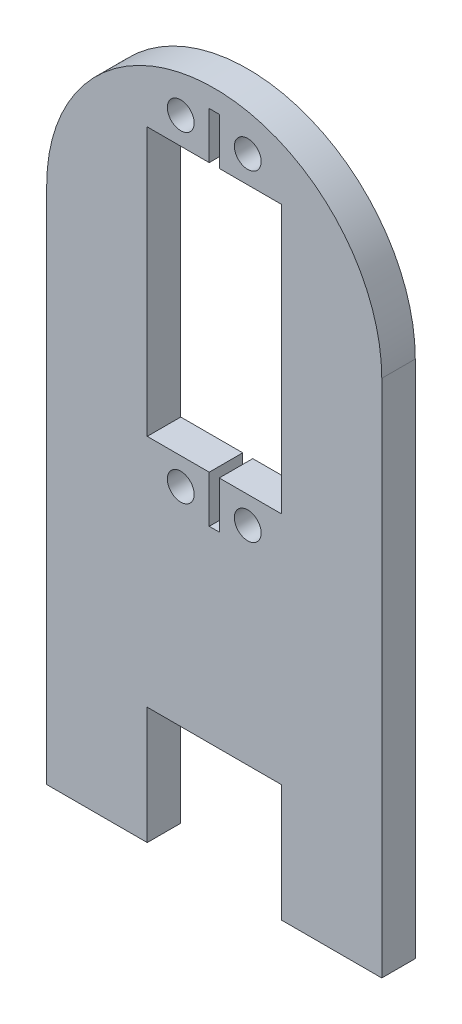
ISO-10303-21;
HEADER;
FILE_DESCRIPTION(('STEP AP214'),'2;1');
FILE_NAME('part.step','',(''),(''),'','','');
FILE_SCHEMA(('AUTOMOTIVE_DESIGN { 1 0 10303 214 1 1 1 1 }'));
ENDSEC;
DATA;
#1=APPLICATION_CONTEXT('core data for automotive mechanical design processes');
#2=APPLICATION_PROTOCOL_DEFINITION('international standard','automotive_design',2000,#1);
#3=PRODUCT_CONTEXT('',#1,'mechanical');
#4=PRODUCT('Part','Part','',(#3));
#5=PRODUCT_RELATED_PRODUCT_CATEGORY('part','',(#4));
#6=PRODUCT_DEFINITION_FORMATION('','',#4);
#7=PRODUCT_DEFINITION_CONTEXT('part definition',#1,'design');
#8=PRODUCT_DEFINITION('design','',#6,#7);
#9=PRODUCT_DEFINITION_SHAPE('','',#8);
#10=(LENGTH_UNIT() NAMED_UNIT(*) SI_UNIT(.MILLI.,.METRE.));
#11=(NAMED_UNIT(*) PLANE_ANGLE_UNIT() SI_UNIT($,.RADIAN.));
#12=(NAMED_UNIT(*) SI_UNIT($,.STERADIAN.) SOLID_ANGLE_UNIT());
#13=UNCERTAINTY_MEASURE_WITH_UNIT(LENGTH_MEASURE(1.E-05),#10,'distance_accuracy_value','');
#14=(GEOMETRIC_REPRESENTATION_CONTEXT(3) GLOBAL_UNCERTAINTY_ASSIGNED_CONTEXT((#13)) GLOBAL_UNIT_ASSIGNED_CONTEXT((#10,
#11,#12)) REPRESENTATION_CONTEXT('',''));
#15=CARTESIAN_POINT('',(0.,0.,0.));
#16=DIRECTION('',(0.,0.,1.));
#17=DIRECTION('',(1.,0.,0.));
#18=AXIS2_PLACEMENT_3D('',#15,#16,#17);
#19=CARTESIAN_POINT('',(4.99999999999999,24.,5.));
#20=DIRECTION('',(0.,0.,-1.));
#21=DIRECTION('',(-1.,0.,0.));
#22=AXIS2_PLACEMENT_3D('',#19,#20,#21);
#23=CYLINDRICAL_SURFACE('',#22,2.);
#24=CARTESIAN_POINT('',(4.99999999999999,24.,5.));
#25=DIRECTION('',(0.,0.,1.));
#26=DIRECTION('',(1.,0.,0.));
#27=AXIS2_PLACEMENT_3D('',#24,#25,#26);
#28=CIRCLE('',#27,2.);
#29=CARTESIAN_POINT('',(7.,24.,5.));
#30=VERTEX_POINT('',#29);
#31=EDGE_CURVE('E255',#30,#30,#28,.T.);
#32=ORIENTED_EDGE('',*,*,#31,.T.);
#33=EDGE_LOOP('',(#32));
#34=FACE_BOUND('',#33,.T.);
#35=CARTESIAN_POINT('',(4.99999999999999,24.,0.));
#36=DIRECTION('',(0.,0.,1.));
#37=DIRECTION('',(1.,0.,0.));
#38=AXIS2_PLACEMENT_3D('',#35,#36,#37);
#39=CIRCLE('',#38,2.);
#40=CARTESIAN_POINT('',(7.,24.,0.));
#41=VERTEX_POINT('',#40);
#42=EDGE_CURVE('E279',#41,#41,#39,.T.);
#43=ORIENTED_EDGE('',*,*,#42,.F.);
#44=EDGE_LOOP('',(#43));
#45=FACE_BOUND('',#44,.T.);
#46=ADVANCED_FACE('F107',(#34,#45),#23,.F.);
#47=CARTESIAN_POINT('',(-5.00000000000001,24.,5.));
#48=DIRECTION('',(0.,0.,-1.));
#49=DIRECTION('',(-1.,0.,0.));
#50=AXIS2_PLACEMENT_3D('',#47,#48,#49);
#51=CYLINDRICAL_SURFACE('',#50,2.);
#52=CARTESIAN_POINT('',(-5.00000000000001,24.,5.));
#53=DIRECTION('',(0.,0.,1.));
#54=DIRECTION('',(1.,0.,0.));
#55=AXIS2_PLACEMENT_3D('',#52,#53,#54);
#56=CIRCLE('',#55,2.);
#57=CARTESIAN_POINT('',(-3.,24.,5.));
#58=VERTEX_POINT('',#57);
#59=EDGE_CURVE('E331',#58,#58,#56,.T.);
#60=ORIENTED_EDGE('',*,*,#59,.T.);
#61=EDGE_LOOP('',(#60));
#62=FACE_BOUND('',#61,.T.);
#63=CARTESIAN_POINT('',(-5.00000000000001,24.,0.));
#64=DIRECTION('',(0.,0.,1.));
#65=DIRECTION('',(1.,0.,0.));
#66=AXIS2_PLACEMENT_3D('',#63,#64,#65);
#67=CIRCLE('',#66,2.);
#68=CARTESIAN_POINT('',(-3.,24.,0.));
#69=VERTEX_POINT('',#68);
#70=EDGE_CURVE('E282',#69,#69,#67,.T.);
#71=ORIENTED_EDGE('',*,*,#70,.F.);
#72=EDGE_LOOP('',(#71));
#73=FACE_BOUND('',#72,.T.);
#74=ADVANCED_FACE('F425',(#62,#73),#51,.F.);
#75=CARTESIAN_POINT('',(-5.00000000000001,-24.,5.));
#76=DIRECTION('',(0.,0.,-1.));
#77=DIRECTION('',(-1.,0.,0.));
#78=AXIS2_PLACEMENT_3D('',#75,#76,#77);
#79=CYLINDRICAL_SURFACE('',#78,2.);
#80=CARTESIAN_POINT('',(-5.00000000000001,-24.,5.));
#81=DIRECTION('',(0.,0.,1.));
#82=DIRECTION('',(1.,0.,0.));
#83=AXIS2_PLACEMENT_3D('',#80,#81,#82);
#84=CIRCLE('',#83,2.);
#85=CARTESIAN_POINT('',(-3.,-24.,5.));
#86=VERTEX_POINT('',#85);
#87=EDGE_CURVE('E334',#86,#86,#84,.F.);
#88=ORIENTED_EDGE('',*,*,#87,.F.);
#89=EDGE_LOOP('',(#88));
#90=FACE_BOUND('',#89,.T.);
#91=CARTESIAN_POINT('',(-5.00000000000001,-24.,0.));
#92=DIRECTION('',(0.,0.,1.));
#93=DIRECTION('',(1.,0.,0.));
#94=AXIS2_PLACEMENT_3D('',#91,#92,#93);
#95=CIRCLE('',#94,2.);
#96=CARTESIAN_POINT('',(-3.,-24.,0.));
#97=VERTEX_POINT('',#96);
#98=EDGE_CURVE('E285',#97,#97,#95,.F.);
#99=ORIENTED_EDGE('',*,*,#98,.T.);
#100=EDGE_LOOP('',(#99));
#101=FACE_BOUND('',#100,.T.);
#102=ADVANCED_FACE('F431',(#90,#101),#79,.F.);
#103=CARTESIAN_POINT('',(10.,0.,5.));
#104=DIRECTION('',(1.,0.,0.));
#105=DIRECTION('',(0.,0.,-1.));
#106=AXIS2_PLACEMENT_3D('',#103,#104,#105);
#107=PLANE('',#106);
#108=DIRECTION('',(0.,-1.,0.));
#109=VECTOR('',#108,1.);
#110=CARTESIAN_POINT('',(10.,0.,0.));
#111=LINE('',#110,#109);
#112=CARTESIAN_POINT('',(10.,20.,0.));
#113=VERTEX_POINT('',#112);
#114=CARTESIAN_POINT('',(10.,-20.,0.));
#115=VERTEX_POINT('',#114);
#116=EDGE_CURVE('E312',#113,#115,#111,.T.);
#117=ORIENTED_EDGE('',*,*,#116,.T.);
#118=DIRECTION('',(0.,0.,-1.));
#119=VECTOR('',#118,1.);
#120=CARTESIAN_POINT('',(10.,-20.,5.));
#121=LINE('',#120,#119);
#122=CARTESIAN_POINT('',(10.,-20.,5.));
#123=VERTEX_POINT('',#122);
#124=EDGE_CURVE('E117',#123,#115,#121,.T.);
#125=ORIENTED_EDGE('',*,*,#124,.F.);
#126=DIRECTION('',(0.,-1.,0.));
#127=VECTOR('',#126,1.);
#128=CARTESIAN_POINT('',(10.,0.,5.));
#129=LINE('',#128,#127);
#130=CARTESIAN_POINT('',(10.,20.,5.));
#131=VERTEX_POINT('',#130);
#132=EDGE_CURVE('E360',#131,#123,#129,.T.);
#133=ORIENTED_EDGE('',*,*,#132,.F.);
#134=DIRECTION('',(0.,0.,-1.));
#135=VECTOR('',#134,1.);
#136=CARTESIAN_POINT('',(10.,20.,5.));
#137=LINE('',#136,#135);
#138=EDGE_CURVE('E12',#131,#113,#137,.T.);
#139=ORIENTED_EDGE('',*,*,#138,.T.);
#140=EDGE_LOOP('',(#117,#125,#133,#139));
#141=FACE_BOUND('',#140,.T.);
#142=ADVANCED_FACE('F440',(#141),#107,.F.);
#143=CARTESIAN_POINT('',(0.,-20.,5.));
#144=DIRECTION('',(0.,1.,0.));
#145=DIRECTION('',(0.,0.,1.));
#146=AXIS2_PLACEMENT_3D('',#143,#144,#145);
#147=PLANE('',#146);
#148=DIRECTION('',(1.,0.,0.));
#149=VECTOR('',#148,1.);
#150=CARTESIAN_POINT('',(0.,-20.,0.));
#151=LINE('',#150,#149);
#152=CARTESIAN_POINT('',(0.750000000000011,-20.,0.));
#153=VERTEX_POINT('',#152);
#154=EDGE_CURVE('E309',#153,#115,#151,.T.);
#155=ORIENTED_EDGE('',*,*,#154,.F.);
#156=DIRECTION('',(0.,0.,-1.));
#157=VECTOR('',#156,1.);
#158=CARTESIAN_POINT('',(0.750000000000011,-20.,5.));
#159=LINE('',#158,#157);
#160=CARTESIAN_POINT('',(0.750000000000011,-20.,5.));
#161=VERTEX_POINT('',#160);
#162=EDGE_CURVE('E258',#161,#153,#159,.T.);
#163=ORIENTED_EDGE('',*,*,#162,.F.);
#164=DIRECTION('',(1.,0.,0.));
#165=VECTOR('',#164,1.);
#166=CARTESIAN_POINT('',(0.,-20.,5.));
#167=LINE('',#166,#165);
#168=EDGE_CURVE('E357',#161,#123,#167,.T.);
#169=ORIENTED_EDGE('',*,*,#168,.T.);
#170=ORIENTED_EDGE('',*,*,#124,.T.);
#171=EDGE_LOOP('',(#155,#163,#169,#170));
#172=FACE_BOUND('',#171,.T.);
#173=ADVANCED_FACE('F468',(#172),#147,.T.);
#174=CARTESIAN_POINT('',(0.750000000000003,0.,5.));
#175=DIRECTION('',(-1.,0.,0.));
#176=DIRECTION('',(0.,-1.,0.));
#177=AXIS2_PLACEMENT_3D('',#174,#175,#176);
#178=PLANE('',#177);
#179=DIRECTION('',(0.,1.,0.));
#180=VECTOR('',#179,1.);
#181=CARTESIAN_POINT('',(0.750000000000003,0.,0.));
#182=LINE('',#181,#180);
#183=CARTESIAN_POINT('',(0.750000000000012,-27.,0.));
#184=VERTEX_POINT('',#183);
#185=EDGE_CURVE('E306',#184,#153,#182,.T.);
#186=ORIENTED_EDGE('',*,*,#185,.F.);
#187=DIRECTION('',(0.,0.,-1.));
#188=VECTOR('',#187,1.);
#189=CARTESIAN_POINT('',(0.750000000000012,-27.,5.));
#190=LINE('',#189,#188);
#191=CARTESIAN_POINT('',(0.750000000000012,-27.,5.));
#192=VERTEX_POINT('',#191);
#193=EDGE_CURVE('E260',#192,#184,#190,.T.);
#194=ORIENTED_EDGE('',*,*,#193,.F.);
#195=DIRECTION('',(0.,1.,0.));
#196=VECTOR('',#195,1.);
#197=CARTESIAN_POINT('',(0.750000000000003,0.,5.));
#198=LINE('',#197,#196);
#199=EDGE_CURVE('E354',#192,#161,#198,.T.);
#200=ORIENTED_EDGE('',*,*,#199,.T.);
#201=ORIENTED_EDGE('',*,*,#162,.T.);
#202=EDGE_LOOP('',(#186,#194,#200,#201));
#203=FACE_BOUND('',#202,.T.);
#204=ADVANCED_FACE('F475',(#203),#178,.T.);
#205=CARTESIAN_POINT('',(0.,-27.,5.));
#206=DIRECTION('',(0.,1.,0.));
#207=DIRECTION('',(0.,0.,1.));
#208=AXIS2_PLACEMENT_3D('',#205,#206,#207);
#209=PLANE('',#208);
#210=DIRECTION('',(1.,0.,0.));
#211=VECTOR('',#210,1.);
#212=CARTESIAN_POINT('',(0.,-27.,0.));
#213=LINE('',#212,#211);
#214=CARTESIAN_POINT('',(-0.750000000000001,-27.,0.));
#215=VERTEX_POINT('',#214);
#216=EDGE_CURVE('E303',#215,#184,#213,.T.);
#217=ORIENTED_EDGE('',*,*,#216,.F.);
#218=DIRECTION('',(0.,0.,-1.));
#219=VECTOR('',#218,1.);
#220=CARTESIAN_POINT('',(-0.750000000000001,-27.,5.));
#221=LINE('',#220,#219);
#222=CARTESIAN_POINT('',(-0.750000000000001,-27.,5.));
#223=VERTEX_POINT('',#222);
#224=EDGE_CURVE('E262',#223,#215,#221,.T.);
#225=ORIENTED_EDGE('',*,*,#224,.F.);
#226=DIRECTION('',(1.,0.,0.));
#227=VECTOR('',#226,1.);
#228=CARTESIAN_POINT('',(0.,-27.,5.));
#229=LINE('',#228,#227);
#230=EDGE_CURVE('E351',#223,#192,#229,.T.);
#231=ORIENTED_EDGE('',*,*,#230,.T.);
#232=ORIENTED_EDGE('',*,*,#193,.T.);
#233=EDGE_LOOP('',(#217,#225,#231,#232));
#234=FACE_BOUND('',#233,.T.);
#235=ADVANCED_FACE('F471',(#234),#209,.T.);
#236=CARTESIAN_POINT('',(-0.749999999999998,0.,5.));
#237=DIRECTION('',(-1.,0.,0.));
#238=DIRECTION('',(0.,-1.,0.));
#239=AXIS2_PLACEMENT_3D('',#236,#237,#238);
#240=PLANE('',#239);
#241=DIRECTION('',(0.,1.,0.));
#242=VECTOR('',#241,1.);
#243=CARTESIAN_POINT('',(-0.749999999999998,0.,0.));
#244=LINE('',#243,#242);
#245=CARTESIAN_POINT('',(-0.75,-20.,0.));
#246=VERTEX_POINT('',#245);
#247=EDGE_CURVE('E300',#215,#246,#244,.T.);
#248=ORIENTED_EDGE('',*,*,#247,.T.);
#249=DIRECTION('',(0.,0.,-1.));
#250=VECTOR('',#249,1.);
#251=CARTESIAN_POINT('',(-0.75,-20.,5.));
#252=LINE('',#251,#250);
#253=CARTESIAN_POINT('',(-0.75,-20.,5.));
#254=VERTEX_POINT('',#253);
#255=EDGE_CURVE('E264',#254,#246,#252,.T.);
#256=ORIENTED_EDGE('',*,*,#255,.F.);
#257=DIRECTION('',(0.,1.,0.));
#258=VECTOR('',#257,1.);
#259=CARTESIAN_POINT('',(-0.749999999999998,0.,5.));
#260=LINE('',#259,#258);
#261=EDGE_CURVE('E348',#223,#254,#260,.T.);
#262=ORIENTED_EDGE('',*,*,#261,.F.);
#263=ORIENTED_EDGE('',*,*,#224,.T.);
#264=EDGE_LOOP('',(#248,#256,#262,#263));
#265=FACE_BOUND('',#264,.T.);
#266=ADVANCED_FACE('F466',(#265),#240,.F.);
#267=CARTESIAN_POINT('',(-9.99999999999999,-20.,0.));
#268=VERTEX_POINT('',#267);
#269=EDGE_CURVE('E299',#268,#246,#151,.T.);
#270=ORIENTED_EDGE('',*,*,#269,.F.);
#271=DIRECTION('',(0.,0.,-1.));
#272=VECTOR('',#271,1.);
#273=CARTESIAN_POINT('',(-9.99999999999999,-20.,5.));
#274=LINE('',#273,#272);
#275=CARTESIAN_POINT('',(-9.99999999999999,-20.,5.));
#276=VERTEX_POINT('',#275);
#277=EDGE_CURVE('E266',#276,#268,#274,.T.);
#278=ORIENTED_EDGE('',*,*,#277,.F.);
#279=EDGE_CURVE('E347',#276,#254,#167,.T.);
#280=ORIENTED_EDGE('',*,*,#279,.T.);
#281=ORIENTED_EDGE('',*,*,#255,.T.);
#282=EDGE_LOOP('',(#270,#278,#280,#281));
#283=FACE_BOUND('',#282,.T.);
#284=ADVANCED_FACE('F462',(#283),#147,.T.);
#285=CARTESIAN_POINT('',(-9.99999999999999,0.,5.));
#286=DIRECTION('',(1.,0.,0.));
#287=DIRECTION('',(0.,1.,0.));
#288=AXIS2_PLACEMENT_3D('',#285,#286,#287);
#289=PLANE('',#288);
#290=DIRECTION('',(0.,-1.,0.));
#291=VECTOR('',#290,1.);
#292=CARTESIAN_POINT('',(-9.99999999999999,0.,0.));
#293=LINE('',#292,#291);
#294=CARTESIAN_POINT('',(-9.99999999999999,20.,0.));
#295=VERTEX_POINT('',#294);
#296=EDGE_CURVE('E296',#295,#268,#293,.T.);
#297=ORIENTED_EDGE('',*,*,#296,.F.);
#298=DIRECTION('',(0.,0.,-1.));
#299=VECTOR('',#298,1.);
#300=CARTESIAN_POINT('',(-9.99999999999999,20.,5.));
#301=LINE('',#300,#299);
#302=CARTESIAN_POINT('',(-9.99999999999999,20.,5.));
#303=VERTEX_POINT('',#302);
#304=EDGE_CURVE('E268',#303,#295,#301,.T.);
#305=ORIENTED_EDGE('',*,*,#304,.F.);
#306=DIRECTION('',(0.,-1.,0.));
#307=VECTOR('',#306,1.);
#308=CARTESIAN_POINT('',(-9.99999999999999,0.,5.));
#309=LINE('',#308,#307);
#310=EDGE_CURVE('E344',#303,#276,#309,.T.);
#311=ORIENTED_EDGE('',*,*,#310,.T.);
#312=ORIENTED_EDGE('',*,*,#277,.T.);
#313=EDGE_LOOP('',(#297,#305,#311,#312));
#314=FACE_BOUND('',#313,.T.);
#315=ADVANCED_FACE('F458',(#314),#289,.T.);
#316=CARTESIAN_POINT('',(0.,20.,5.));
#317=DIRECTION('',(0.,1.,0.));
#318=DIRECTION('',(0.,0.,1.));
#319=AXIS2_PLACEMENT_3D('',#316,#317,#318);
#320=PLANE('',#319);
#321=DIRECTION('',(1.,0.,0.));
#322=VECTOR('',#321,1.);
#323=CARTESIAN_POINT('',(0.,20.,0.));
#324=LINE('',#323,#322);
#325=CARTESIAN_POINT('',(-0.75,20.,0.));
#326=VERTEX_POINT('',#325);
#327=EDGE_CURVE('E295',#295,#326,#324,.T.);
#328=ORIENTED_EDGE('',*,*,#327,.T.);
#329=DIRECTION('',(0.,0.,-1.));
#330=VECTOR('',#329,1.);
#331=CARTESIAN_POINT('',(-0.75,20.,5.));
#332=LINE('',#331,#330);
#333=CARTESIAN_POINT('',(-0.75,20.,5.));
#334=VERTEX_POINT('',#333);
#335=EDGE_CURVE('E270',#334,#326,#332,.T.);
#336=ORIENTED_EDGE('',*,*,#335,.F.);
#337=DIRECTION('',(1.,0.,0.));
#338=VECTOR('',#337,1.);
#339=CARTESIAN_POINT('',(0.,20.,5.));
#340=LINE('',#339,#338);
#341=EDGE_CURVE('E343',#303,#334,#340,.T.);
#342=ORIENTED_EDGE('',*,*,#341,.F.);
#343=ORIENTED_EDGE('',*,*,#304,.T.);
#344=EDGE_LOOP('',(#328,#336,#342,#343));
#345=FACE_BOUND('',#344,.T.);
#346=ADVANCED_FACE('F454',(#345),#320,.F.);
#347=CARTESIAN_POINT('',(-0.749999999999998,0.,5.));
#348=DIRECTION('',(1.,0.,0.));
#349=DIRECTION('',(0.,1.,0.));
#350=AXIS2_PLACEMENT_3D('',#347,#348,#349);
#351=PLANE('',#350);
#352=DIRECTION('',(0.,-1.,0.));
#353=VECTOR('',#352,1.);
#354=CARTESIAN_POINT('',(-0.749999999999998,0.,0.));
#355=LINE('',#354,#353);
#356=CARTESIAN_POINT('',(-0.750000000000001,27.,0.));
#357=VERTEX_POINT('',#356);
#358=EDGE_CURVE('E292',#357,#326,#355,.T.);
#359=ORIENTED_EDGE('',*,*,#358,.F.);
#360=DIRECTION('',(0.,0.,-1.));
#361=VECTOR('',#360,1.);
#362=CARTESIAN_POINT('',(-0.750000000000001,27.,5.));
#363=LINE('',#362,#361);
#364=CARTESIAN_POINT('',(-0.750000000000001,27.,5.));
#365=VERTEX_POINT('',#364);
#366=EDGE_CURVE('E272',#365,#357,#363,.T.);
#367=ORIENTED_EDGE('',*,*,#366,.F.);
#368=DIRECTION('',(0.,-1.,0.));
#369=VECTOR('',#368,1.);
#370=CARTESIAN_POINT('',(-0.749999999999998,0.,5.));
#371=LINE('',#370,#369);
#372=EDGE_CURVE('E340',#365,#334,#371,.T.);
#373=ORIENTED_EDGE('',*,*,#372,.T.);
#374=ORIENTED_EDGE('',*,*,#335,.T.);
#375=EDGE_LOOP('',(#359,#367,#373,#374));
#376=FACE_BOUND('',#375,.T.);
#377=ADVANCED_FACE('F450',(#376),#351,.T.);
#378=CARTESIAN_POINT('',(0.,27.,5.));
#379=DIRECTION('',(0.,1.,0.));
#380=DIRECTION('',(0.,0.,1.));
#381=AXIS2_PLACEMENT_3D('',#378,#379,#380);
#382=PLANE('',#381);
#383=DIRECTION('',(1.,0.,0.));
#384=VECTOR('',#383,1.);
#385=CARTESIAN_POINT('',(0.,27.,0.));
#386=LINE('',#385,#384);
#387=CARTESIAN_POINT('',(0.749999999999999,27.,0.));
#388=VERTEX_POINT('',#387);
#389=EDGE_CURVE('E290',#357,#388,#386,.T.);
#390=ORIENTED_EDGE('',*,*,#389,.T.);
#391=DIRECTION('',(0.,0.,-1.));
#392=VECTOR('',#391,1.);
#393=CARTESIAN_POINT('',(0.749999999999999,27.,5.));
#394=LINE('',#393,#392);
#395=CARTESIAN_POINT('',(0.749999999999999,27.,5.));
#396=VERTEX_POINT('',#395);
#397=EDGE_CURVE('E274',#396,#388,#394,.T.);
#398=ORIENTED_EDGE('',*,*,#397,.F.);
#399=DIRECTION('',(1.,0.,0.));
#400=VECTOR('',#399,1.);
#401=CARTESIAN_POINT('',(0.,27.,5.));
#402=LINE('',#401,#400);
#403=EDGE_CURVE('E338',#365,#396,#402,.T.);
#404=ORIENTED_EDGE('',*,*,#403,.F.);
#405=ORIENTED_EDGE('',*,*,#366,.T.);
#406=EDGE_LOOP('',(#390,#398,#404,#405));
#407=FACE_BOUND('',#406,.T.);
#408=ADVANCED_FACE('F446',(#407),#382,.F.);
#409=CARTESIAN_POINT('',(0.750000000000003,0.,5.));
#410=DIRECTION('',(1.,0.,0.));
#411=DIRECTION('',(0.,1.,0.));
#412=AXIS2_PLACEMENT_3D('',#409,#410,#411);
#413=PLANE('',#412);
#414=DIRECTION('',(0.,-1.,0.));
#415=VECTOR('',#414,1.);
#416=CARTESIAN_POINT('',(0.750000000000003,0.,0.));
#417=LINE('',#416,#415);
#418=CARTESIAN_POINT('',(0.75,20.,0.));
#419=VERTEX_POINT('',#418);
#420=EDGE_CURVE('E288',#388,#419,#417,.T.);
#421=ORIENTED_EDGE('',*,*,#420,.T.);
#422=DIRECTION('',(0.,0.,-1.));
#423=VECTOR('',#422,1.);
#424=CARTESIAN_POINT('',(0.75,20.,5.));
#425=LINE('',#424,#423);
#426=CARTESIAN_POINT('',(0.75,20.,5.));
#427=VERTEX_POINT('',#426);
#428=EDGE_CURVE('E248',#427,#419,#425,.T.);
#429=ORIENTED_EDGE('',*,*,#428,.F.);
#430=DIRECTION('',(0.,-1.,0.));
#431=VECTOR('',#430,1.);
#432=CARTESIAN_POINT('',(0.750000000000003,0.,5.));
#433=LINE('',#432,#431);
#434=EDGE_CURVE('E126',#396,#427,#433,.T.);
#435=ORIENTED_EDGE('',*,*,#434,.F.);
#436=ORIENTED_EDGE('',*,*,#397,.T.);
#437=EDGE_LOOP('',(#421,#429,#435,#436));
#438=FACE_BOUND('',#437,.T.);
#439=ADVANCED_FACE('F442',(#438),#413,.F.);
#440=EDGE_CURVE('E315',#419,#113,#324,.T.);
#441=ORIENTED_EDGE('',*,*,#440,.T.);
#442=ORIENTED_EDGE('',*,*,#138,.F.);
#443=EDGE_CURVE('E363',#427,#131,#340,.T.);
#444=ORIENTED_EDGE('',*,*,#443,.F.);
#445=ORIENTED_EDGE('',*,*,#428,.T.);
#446=EDGE_LOOP('',(#441,#442,#444,#445));
#447=FACE_BOUND('',#446,.T.);
#448=ADVANCED_FACE('F445',(#447),#320,.F.);
#449=CARTESIAN_POINT('',(4.99999999999999,-24.,5.));
#450=DIRECTION('',(0.,0.,-1.));
#451=DIRECTION('',(-1.,0.,0.));
#452=AXIS2_PLACEMENT_3D('',#449,#450,#451);
#453=CYLINDRICAL_SURFACE('',#452,2.);
#454=CARTESIAN_POINT('',(4.99999999999999,-24.,5.));
#455=DIRECTION('',(0.,0.,1.));
#456=DIRECTION('',(1.,0.,0.));
#457=AXIS2_PLACEMENT_3D('',#454,#455,#456);
#458=CIRCLE('',#457,2.);
#459=CARTESIAN_POINT('',(7.,-24.,5.));
#460=VERTEX_POINT('',#459);
#461=EDGE_CURVE('E365',#460,#460,#458,.F.);
#462=ORIENTED_EDGE('',*,*,#461,.F.);
#463=EDGE_LOOP('',(#462));
#464=FACE_BOUND('',#463,.T.);
#465=CARTESIAN_POINT('',(4.99999999999999,-24.,0.));
#466=DIRECTION('',(0.,0.,1.));
#467=DIRECTION('',(1.,0.,0.));
#468=AXIS2_PLACEMENT_3D('',#465,#466,#467);
#469=CIRCLE('',#468,2.);
#470=CARTESIAN_POINT('',(7.,-24.,0.));
#471=VERTEX_POINT('',#470);
#472=EDGE_CURVE('E318',#471,#471,#469,.F.);
#473=ORIENTED_EDGE('',*,*,#472,.T.);
#474=EDGE_LOOP('',(#473));
#475=FACE_BOUND('',#474,.T.);
#476=ADVANCED_FACE('F482',(#464,#475),#453,.F.);
#477=CARTESIAN_POINT('',(0.,5.,5.));
#478=DIRECTION('',(0.,0.,-1.));
#479=DIRECTION('',(-1.,0.,0.));
#480=AXIS2_PLACEMENT_3D('',#477,#478,#479);
#481=CYLINDRICAL_SURFACE('',#480,25.);
#482=CARTESIAN_POINT('',(0.,5.,0.));
#483=DIRECTION('',(0.,0.,1.));
#484=DIRECTION('',(1.,0.,0.));
#485=AXIS2_PLACEMENT_3D('',#482,#483,#484);
#486=CIRCLE('',#485,25.);
#487=CARTESIAN_POINT('',(25.,5.00000000000001,0.));
#488=VERTEX_POINT('',#487);
#489=CARTESIAN_POINT('',(-25.,5.,0.));
#490=VERTEX_POINT('',#489);
#491=EDGE_CURVE('E218',#488,#490,#486,.T.);
#492=ORIENTED_EDGE('',*,*,#491,.T.);
#493=DIRECTION('',(0.,0.,-1.));
#494=VECTOR('',#493,1.);
#495=CARTESIAN_POINT('',(-25.,5.,5.));
#496=LINE('',#495,#494);
#497=CARTESIAN_POINT('',(-25.,5.,5.));
#498=VERTEX_POINT('',#497);
#499=EDGE_CURVE('E249',#498,#490,#496,.T.);
#500=ORIENTED_EDGE('',*,*,#499,.F.);
#501=CARTESIAN_POINT('',(0.,5.,5.));
#502=DIRECTION('',(0.,0.,1.));
#503=DIRECTION('',(1.,0.,0.));
#504=AXIS2_PLACEMENT_3D('',#501,#502,#503);
#505=CIRCLE('',#504,25.);
#506=CARTESIAN_POINT('',(25.,5.00000000000001,5.));
#507=VERTEX_POINT('',#506);
#508=EDGE_CURVE('E377',#507,#498,#505,.T.);
#509=ORIENTED_EDGE('',*,*,#508,.F.);
#510=DIRECTION('',(0.,0.,-1.));
#511=VECTOR('',#510,1.);
#512=CARTESIAN_POINT('',(25.,5.00000000000001,5.));
#513=LINE('',#512,#511);
#514=EDGE_CURVE('E246',#507,#488,#513,.T.);
#515=ORIENTED_EDGE('',*,*,#514,.T.);
#516=EDGE_LOOP('',(#492,#500,#509,#515));
#517=FACE_BOUND('',#516,.T.);
#518=ADVANCED_FACE('F392',(#517),#481,.T.);
#519=CARTESIAN_POINT('',(-25.,0.,5.));
#520=DIRECTION('',(1.,0.,0.));
#521=DIRECTION('',(0.,1.,0.));
#522=AXIS2_PLACEMENT_3D('',#519,#520,#521);
#523=PLANE('',#522);
#524=DIRECTION('',(0.,-1.,0.));
#525=VECTOR('',#524,1.);
#526=CARTESIAN_POINT('',(-25.,0.,0.));
#527=LINE('',#526,#525);
#528=CARTESIAN_POINT('',(-25.,-72.5,0.));
#529=VERTEX_POINT('',#528);
#530=EDGE_CURVE('E326',#490,#529,#527,.T.);
#531=ORIENTED_EDGE('',*,*,#530,.T.);
#532=DIRECTION('',(0.,0.,-1.));
#533=VECTOR('',#532,1.);
#534=CARTESIAN_POINT('',(-25.,-72.5,5.));
#535=LINE('',#534,#533);
#536=CARTESIAN_POINT('',(-25.,-72.5,5.));
#537=VERTEX_POINT('',#536);
#538=EDGE_CURVE('E236',#537,#529,#535,.T.);
#539=ORIENTED_EDGE('',*,*,#538,.F.);
#540=DIRECTION('',(0.,-1.,0.));
#541=VECTOR('',#540,1.);
#542=CARTESIAN_POINT('',(-25.,0.,5.));
#543=LINE('',#542,#541);
#544=EDGE_CURVE('E375',#498,#537,#543,.T.);
#545=ORIENTED_EDGE('',*,*,#544,.F.);
#546=ORIENTED_EDGE('',*,*,#499,.T.);
#547=EDGE_LOOP('',(#531,#539,#545,#546));
#548=FACE_BOUND('',#547,.T.);
#549=ADVANCED_FACE('F394',(#548),#523,.F.);
#550=CARTESIAN_POINT('',(-9.99999999999999,0.,5.));
#551=DIRECTION('',(1.,0.,0.));
#552=DIRECTION('',(0.,0.,-1.));
#553=AXIS2_PLACEMENT_3D('',#550,#551,#552);
#554=PLANE('',#553);
#555=DIRECTION('',(0.,-1.,0.));
#556=VECTOR('',#555,1.);
#557=CARTESIAN_POINT('',(-9.99999999999999,0.,0.));
#558=LINE('',#557,#556);
#559=CARTESIAN_POINT('',(-9.99999999999999,-55.,0.));
#560=VERTEX_POINT('',#559);
#561=CARTESIAN_POINT('',(-9.99999999999999,-72.5,0.));
#562=VERTEX_POINT('',#561);
#563=EDGE_CURVE('E324',#560,#562,#558,.T.);
#564=ORIENTED_EDGE('',*,*,#563,.F.);
#565=DIRECTION('',(0.,0.,-1.));
#566=VECTOR('',#565,1.);
#567=CARTESIAN_POINT('',(-9.99999999999999,-55.,5.));
#568=LINE('',#567,#566);
#569=CARTESIAN_POINT('',(-9.99999999999999,-55.,5.));
#570=VERTEX_POINT('',#569);
#571=EDGE_CURVE('E252',#570,#560,#568,.T.);
#572=ORIENTED_EDGE('',*,*,#571,.F.);
#573=DIRECTION('',(0.,-1.,0.));
#574=VECTOR('',#573,1.);
#575=CARTESIAN_POINT('',(-9.99999999999999,0.,5.));
#576=LINE('',#575,#574);
#577=CARTESIAN_POINT('',(-9.99999999999999,-72.5,5.));
#578=VERTEX_POINT('',#577);
#579=EDGE_CURVE('E373',#570,#578,#576,.T.);
#580=ORIENTED_EDGE('',*,*,#579,.T.);
#581=DIRECTION('',(0.,0.,-1.));
#582=VECTOR('',#581,1.);
#583=CARTESIAN_POINT('',(-9.99999999999999,-72.5,5.));
#584=LINE('',#583,#582);
#585=EDGE_CURVE('E221',#578,#562,#584,.T.);
#586=ORIENTED_EDGE('',*,*,#585,.T.);
#587=EDGE_LOOP('',(#564,#572,#580,#586));
#588=FACE_BOUND('',#587,.T.);
#589=ADVANCED_FACE('F407',(#588),#554,.T.);
#590=CARTESIAN_POINT('',(0.,-55.,5.));
#591=DIRECTION('',(0.,1.,0.));
#592=DIRECTION('',(0.,0.,1.));
#593=AXIS2_PLACEMENT_3D('',#590,#591,#592);
#594=PLANE('',#593);
#595=DIRECTION('',(1.,0.,0.));
#596=VECTOR('',#595,1.);
#597=CARTESIAN_POINT('',(0.,-55.,0.));
#598=LINE('',#597,#596);
#599=CARTESIAN_POINT('',(10.,-55.,0.));
#600=VERTEX_POINT('',#599);
#601=EDGE_CURVE('E322',#560,#600,#598,.T.);
#602=ORIENTED_EDGE('',*,*,#601,.T.);
#603=DIRECTION('',(0.,0.,-1.));
#604=VECTOR('',#603,1.);
#605=CARTESIAN_POINT('',(10.,-55.,5.));
#606=LINE('',#605,#604);
#607=CARTESIAN_POINT('',(10.,-55.,5.));
#608=VERTEX_POINT('',#607);
#609=EDGE_CURVE('E254',#608,#600,#606,.T.);
#610=ORIENTED_EDGE('',*,*,#609,.F.);
#611=DIRECTION('',(1.,0.,0.));
#612=VECTOR('',#611,1.);
#613=CARTESIAN_POINT('',(0.,-55.,5.));
#614=LINE('',#613,#612);
#615=EDGE_CURVE('E370',#570,#608,#614,.T.);
#616=ORIENTED_EDGE('',*,*,#615,.F.);
#617=ORIENTED_EDGE('',*,*,#571,.T.);
#618=EDGE_LOOP('',(#602,#610,#616,#617));
#619=FACE_BOUND('',#618,.T.);
#620=ADVANCED_FACE('F410',(#619),#594,.F.);
#621=CARTESIAN_POINT('',(10.,0.,5.));
#622=DIRECTION('',(1.,0.,0.));
#623=DIRECTION('',(0.,0.,-1.));
#624=AXIS2_PLACEMENT_3D('',#621,#622,#623);
#625=PLANE('',#624);
#626=DIRECTION('',(0.,-1.,0.));
#627=VECTOR('',#626,1.);
#628=CARTESIAN_POINT('',(10.,0.,0.));
#629=LINE('',#628,#627);
#630=CARTESIAN_POINT('',(10.,-72.5,0.));
#631=VERTEX_POINT('',#630);
#632=EDGE_CURVE('E204',#600,#631,#629,.T.);
#633=ORIENTED_EDGE('',*,*,#632,.T.);
#634=DIRECTION('',(0.,0.,-1.));
#635=VECTOR('',#634,1.);
#636=CARTESIAN_POINT('',(10.,-72.5,5.));
#637=LINE('',#636,#635);
#638=CARTESIAN_POINT('',(10.,-72.5,5.));
#639=VERTEX_POINT('',#638);
#640=EDGE_CURVE('E111',#639,#631,#637,.T.);
#641=ORIENTED_EDGE('',*,*,#640,.F.);
#642=DIRECTION('',(0.,-1.,0.));
#643=VECTOR('',#642,1.);
#644=CARTESIAN_POINT('',(10.,0.,5.));
#645=LINE('',#644,#643);
#646=EDGE_CURVE('E368',#608,#639,#645,.T.);
#647=ORIENTED_EDGE('',*,*,#646,.F.);
#648=ORIENTED_EDGE('',*,*,#609,.T.);
#649=EDGE_LOOP('',(#633,#641,#647,#648));
#650=FACE_BOUND('',#649,.T.);
#651=ADVANCED_FACE('F414',(#650),#625,.F.);
#652=CARTESIAN_POINT('',(25.,0.,5.));
#653=DIRECTION('',(1.,0.,0.));
#654=DIRECTION('',(0.,1.,0.));
#655=AXIS2_PLACEMENT_3D('',#652,#653,#654);
#656=PLANE('',#655);
#657=DIRECTION('',(0.,-1.,0.));
#658=VECTOR('',#657,1.);
#659=CARTESIAN_POINT('',(25.,0.,0.));
#660=LINE('',#659,#658);
#661=CARTESIAN_POINT('',(25.,-72.5,0.));
#662=VERTEX_POINT('',#661);
#663=EDGE_CURVE('E211',#488,#662,#660,.T.);
#664=ORIENTED_EDGE('',*,*,#663,.F.);
#665=ORIENTED_EDGE('',*,*,#514,.F.);
#666=DIRECTION('',(0.,-1.,0.));
#667=VECTOR('',#666,1.);
#668=CARTESIAN_POINT('',(25.,0.,5.));
#669=LINE('',#668,#667);
#670=CARTESIAN_POINT('',(25.,-72.5,5.));
#671=VERTEX_POINT('',#670);
#672=EDGE_CURVE('E227',#507,#671,#669,.T.);
#673=ORIENTED_EDGE('',*,*,#672,.T.);
#674=DIRECTION('',(0.,0.,-1.));
#675=VECTOR('',#674,1.);
#676=CARTESIAN_POINT('',(25.,-72.5,5.));
#677=LINE('',#676,#675);
#678=EDGE_CURVE('E224',#671,#662,#677,.T.);
#679=ORIENTED_EDGE('',*,*,#678,.T.);
#680=EDGE_LOOP('',(#664,#665,#673,#679));
#681=FACE_BOUND('',#680,.T.);
#682=ADVANCED_FACE('F225',(#681),#656,.T.);
#683=CARTESIAN_POINT('',(0.,0.,0.));
#684=DIRECTION('',(0.,0.,1.));
#685=DIRECTION('',(1.,0.,0.));
#686=AXIS2_PLACEMENT_3D('',#683,#684,#685);
#687=PLANE('',#686);
#688=ORIENTED_EDGE('',*,*,#663,.T.);
#689=DIRECTION('',(-1.,0.,0.));
#690=VECTOR('',#689,1.);
#691=CARTESIAN_POINT('',(25.,-72.5,0.));
#692=LINE('',#691,#690);
#693=EDGE_CURVE('E216',#662,#631,#692,.T.);
#694=ORIENTED_EDGE('',*,*,#693,.T.);
#695=ORIENTED_EDGE('',*,*,#632,.F.);
#696=ORIENTED_EDGE('',*,*,#601,.F.);
#697=ORIENTED_EDGE('',*,*,#563,.T.);
#698=DIRECTION('',(-1.,0.,0.));
#699=VECTOR('',#698,1.);
#700=CARTESIAN_POINT('',(-9.99999999999999,-72.5,0.));
#701=LINE('',#700,#699);
#702=EDGE_CURVE('E231',#562,#529,#701,.T.);
#703=ORIENTED_EDGE('',*,*,#702,.T.);
#704=ORIENTED_EDGE('',*,*,#530,.F.);
#705=ORIENTED_EDGE('',*,*,#491,.F.);
#706=EDGE_LOOP('',(#688,#694,#695,#696,#697,#703,#704,#705));
#707=FACE_BOUND('',#706,.T.);
#708=ORIENTED_EDGE('',*,*,#472,.F.);
#709=EDGE_LOOP('',(#708));
#710=FACE_BOUND('',#709,.T.);
#711=ORIENTED_EDGE('',*,*,#440,.F.);
#712=ORIENTED_EDGE('',*,*,#420,.F.);
#713=ORIENTED_EDGE('',*,*,#389,.F.);
#714=ORIENTED_EDGE('',*,*,#358,.T.);
#715=ORIENTED_EDGE('',*,*,#327,.F.);
#716=ORIENTED_EDGE('',*,*,#296,.T.);
#717=ORIENTED_EDGE('',*,*,#269,.T.);
#718=ORIENTED_EDGE('',*,*,#247,.F.);
#719=ORIENTED_EDGE('',*,*,#216,.T.);
#720=ORIENTED_EDGE('',*,*,#185,.T.);
#721=ORIENTED_EDGE('',*,*,#154,.T.);
#722=ORIENTED_EDGE('',*,*,#116,.F.);
#723=EDGE_LOOP('',(#711,#712,#713,#714,#715,#716,#717,#718,#719,#720,#721,#722));
#724=FACE_BOUND('',#723,.T.);
#725=ORIENTED_EDGE('',*,*,#98,.F.);
#726=EDGE_LOOP('',(#725));
#727=FACE_BOUND('',#726,.T.);
#728=ORIENTED_EDGE('',*,*,#70,.T.);
#729=EDGE_LOOP('',(#728));
#730=FACE_BOUND('',#729,.T.);
#731=ORIENTED_EDGE('',*,*,#42,.T.);
#732=EDGE_LOOP('',(#731));
#733=FACE_BOUND('',#732,.T.);
#734=ADVANCED_FACE('F213',(#707,#710,#724,#727,#730,#733),#687,.F.);
#735=CARTESIAN_POINT('',(0.,0.,5.));
#736=DIRECTION('',(0.,0.,1.));
#737=DIRECTION('',(1.,0.,0.));
#738=AXIS2_PLACEMENT_3D('',#735,#736,#737);
#739=PLANE('',#738);
#740=ORIENTED_EDGE('',*,*,#672,.F.);
#741=ORIENTED_EDGE('',*,*,#508,.T.);
#742=ORIENTED_EDGE('',*,*,#544,.T.);
#743=DIRECTION('',(-1.,0.,0.));
#744=VECTOR('',#743,1.);
#745=CARTESIAN_POINT('',(-9.99999999999999,-72.5,5.));
#746=LINE('',#745,#744);
#747=EDGE_CURVE('E239',#578,#537,#746,.T.);
#748=ORIENTED_EDGE('',*,*,#747,.F.);
#749=ORIENTED_EDGE('',*,*,#579,.F.);
#750=ORIENTED_EDGE('',*,*,#615,.T.);
#751=ORIENTED_EDGE('',*,*,#646,.T.);
#752=DIRECTION('',(-1.,0.,0.));
#753=VECTOR('',#752,1.);
#754=CARTESIAN_POINT('',(25.,-72.5,5.));
#755=LINE('',#754,#753);
#756=EDGE_CURVE('E232',#671,#639,#755,.T.);
#757=ORIENTED_EDGE('',*,*,#756,.F.);
#758=EDGE_LOOP('',(#740,#741,#742,#748,#749,#750,#751,#757));
#759=FACE_BOUND('',#758,.T.);
#760=ORIENTED_EDGE('',*,*,#461,.T.);
#761=EDGE_LOOP('',(#760));
#762=FACE_BOUND('',#761,.T.);
#763=ORIENTED_EDGE('',*,*,#443,.T.);
#764=ORIENTED_EDGE('',*,*,#132,.T.);
#765=ORIENTED_EDGE('',*,*,#168,.F.);
#766=ORIENTED_EDGE('',*,*,#199,.F.);
#767=ORIENTED_EDGE('',*,*,#230,.F.);
#768=ORIENTED_EDGE('',*,*,#261,.T.);
#769=ORIENTED_EDGE('',*,*,#279,.F.);
#770=ORIENTED_EDGE('',*,*,#310,.F.);
#771=ORIENTED_EDGE('',*,*,#341,.T.);
#772=ORIENTED_EDGE('',*,*,#372,.F.);
#773=ORIENTED_EDGE('',*,*,#403,.T.);
#774=ORIENTED_EDGE('',*,*,#434,.T.);
#775=EDGE_LOOP('',(#763,#764,#765,#766,#767,#768,#769,#770,#771,#772,#773,#774));
#776=FACE_BOUND('',#775,.T.);
#777=ORIENTED_EDGE('',*,*,#87,.T.);
#778=EDGE_LOOP('',(#777));
#779=FACE_BOUND('',#778,.T.);
#780=ORIENTED_EDGE('',*,*,#59,.F.);
#781=EDGE_LOOP('',(#780));
#782=FACE_BOUND('',#781,.T.);
#783=ORIENTED_EDGE('',*,*,#31,.F.);
#784=EDGE_LOOP('',(#783));
#785=FACE_BOUND('',#784,.T.);
#786=ADVANCED_FACE('F384',(#759,#762,#776,#779,#782,#785),#739,.T.);
#787=CARTESIAN_POINT('',(25.,-72.5,5.));
#788=DIRECTION('',(0.,-1.,0.));
#789=DIRECTION('',(0.,0.,-1.));
#790=AXIS2_PLACEMENT_3D('',#787,#788,#789);
#791=PLANE('',#790);
#792=ORIENTED_EDGE('',*,*,#693,.F.);
#793=ORIENTED_EDGE('',*,*,#678,.F.);
#794=ORIENTED_EDGE('',*,*,#756,.T.);
#795=ORIENTED_EDGE('',*,*,#640,.T.);
#796=EDGE_LOOP('',(#792,#793,#794,#795));
#797=FACE_BOUND('',#796,.T.);
#798=ADVANCED_FACE('F109',(#797),#791,.T.);
#799=CARTESIAN_POINT('',(-9.99999999999999,-72.5,5.));
#800=DIRECTION('',(0.,-1.,0.));
#801=DIRECTION('',(0.,0.,-1.));
#802=AXIS2_PLACEMENT_3D('',#799,#800,#801);
#803=PLANE('',#802);
#804=ORIENTED_EDGE('',*,*,#702,.F.);
#805=ORIENTED_EDGE('',*,*,#585,.F.);
#806=ORIENTED_EDGE('',*,*,#747,.T.);
#807=ORIENTED_EDGE('',*,*,#538,.T.);
#808=EDGE_LOOP('',(#804,#805,#806,#807));
#809=FACE_BOUND('',#808,.T.);
#810=ADVANCED_FACE('F398',(#809),#803,.T.);
#811=CLOSED_SHELL('',(#46,#74,#102,#142,#173,#204,#235,#266,#284,#315,#346,#377,#408,#439,#448,
#476,#518,#549,#589,#620,#651,#682,#734,#786,#798,#810));
#812=MANIFOLD_SOLID_BREP('B2',#811);
#813=ADVANCED_BREP_SHAPE_REPRESENTATION('',(#18,#812),#14);
#814=SHAPE_DEFINITION_REPRESENTATION(#9,#813);
ENDSEC;
END-ISO-10303-21;
